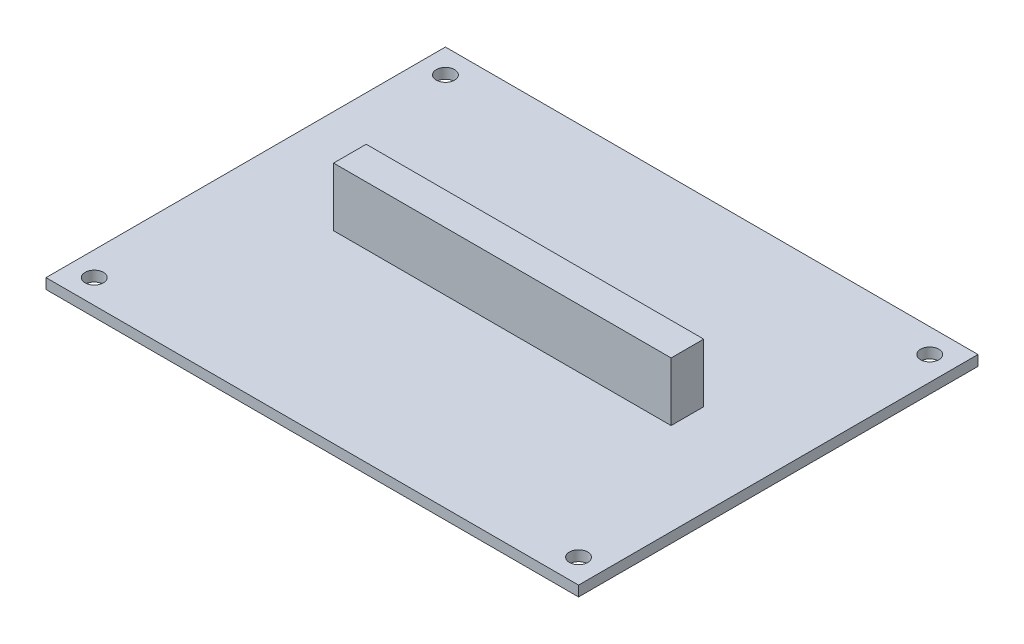
ISO-10303-21;
HEADER;
FILE_DESCRIPTION(('STEP AP214'),'2;1');
FILE_NAME('part.step','',(''),(''),'','','');
FILE_SCHEMA(('AUTOMOTIVE_DESIGN { 1 0 10303 214 1 1 1 1 }'));
ENDSEC;
DATA;
#1=APPLICATION_CONTEXT('core data for automotive mechanical design processes');
#2=APPLICATION_PROTOCOL_DEFINITION('international standard','automotive_design',2000,#1);
#3=PRODUCT_CONTEXT('',#1,'mechanical');
#4=PRODUCT('Part','Part','',(#3));
#5=PRODUCT_RELATED_PRODUCT_CATEGORY('part','',(#4));
#6=PRODUCT_DEFINITION_FORMATION('','',#4);
#7=PRODUCT_DEFINITION_CONTEXT('part definition',#1,'design');
#8=PRODUCT_DEFINITION('design','',#6,#7);
#9=PRODUCT_DEFINITION_SHAPE('','',#8);
#10=(LENGTH_UNIT() NAMED_UNIT(*) SI_UNIT(.MILLI.,.METRE.));
#11=(NAMED_UNIT(*) PLANE_ANGLE_UNIT() SI_UNIT($,.RADIAN.));
#12=(NAMED_UNIT(*) SI_UNIT($,.STERADIAN.) SOLID_ANGLE_UNIT());
#13=UNCERTAINTY_MEASURE_WITH_UNIT(LENGTH_MEASURE(1.E-05),#10,'distance_accuracy_value','');
#14=(GEOMETRIC_REPRESENTATION_CONTEXT(3) GLOBAL_UNCERTAINTY_ASSIGNED_CONTEXT((#13)) GLOBAL_UNIT_ASSIGNED_CONTEXT((#10,
#11,#12)) REPRESENTATION_CONTEXT('',''));
#15=CARTESIAN_POINT('',(0.,0.,0.));
#16=DIRECTION('',(0.,0.,1.));
#17=DIRECTION('',(1.,0.,0.));
#18=AXIS2_PLACEMENT_3D('',#15,#16,#17);
#19=CARTESIAN_POINT('',(0.,1.55,0.));
#20=DIRECTION('',(0.,-1.,0.));
#21=DIRECTION('',(0.,0.,-1.));
#22=AXIS2_PLACEMENT_3D('',#19,#20,#21);
#23=PLANE('',#22);
#24=CARTESIAN_POINT('',(36.375,1.55,26.375));
#25=DIRECTION('',(0.,1.,0.));
#26=DIRECTION('',(0.,0.,1.));
#27=AXIS2_PLACEMENT_3D('',#24,#25,#26);
#28=CIRCLE('',#27,1.375);
#29=CARTESIAN_POINT('',(36.375,1.55,25.));
#30=VERTEX_POINT('',#29);
#31=EDGE_CURVE('E132',#30,#30,#28,.T.);
#32=ORIENTED_EDGE('',*,*,#31,.F.);
#33=EDGE_LOOP('',(#32));
#34=FACE_BOUND('',#33,.T.);
#35=CARTESIAN_POINT('',(-36.375,1.55,26.375));
#36=DIRECTION('',(0.,1.,0.));
#37=DIRECTION('',(0.,0.,1.));
#38=AXIS2_PLACEMENT_3D('',#35,#36,#37);
#39=CIRCLE('',#38,1.375);
#40=CARTESIAN_POINT('',(-36.375,1.55,25.));
#41=VERTEX_POINT('',#40);
#42=EDGE_CURVE('E141',#41,#41,#39,.T.);
#43=ORIENTED_EDGE('',*,*,#42,.F.);
#44=EDGE_LOOP('',(#43));
#45=FACE_BOUND('',#44,.T.);
#46=CARTESIAN_POINT('',(-36.375,1.55,-26.375));
#47=DIRECTION('',(0.,1.,0.));
#48=DIRECTION('',(0.,0.,1.));
#49=AXIS2_PLACEMENT_3D('',#46,#47,#48);
#50=CIRCLE('',#49,1.375);
#51=CARTESIAN_POINT('',(-36.375,1.55,-27.75));
#52=VERTEX_POINT('',#51);
#53=EDGE_CURVE('E147',#52,#52,#50,.T.);
#54=ORIENTED_EDGE('',*,*,#53,.F.);
#55=EDGE_LOOP('',(#54));
#56=FACE_BOUND('',#55,.T.);
#57=CARTESIAN_POINT('',(36.375,1.55,-26.375));
#58=DIRECTION('',(0.,1.,0.));
#59=DIRECTION('',(0.,0.,1.));
#60=AXIS2_PLACEMENT_3D('',#57,#58,#59);
#61=CIRCLE('',#60,1.375);
#62=CARTESIAN_POINT('',(36.375,1.55,-27.75));
#63=VERTEX_POINT('',#62);
#64=EDGE_CURVE('E153',#63,#63,#61,.T.);
#65=ORIENTED_EDGE('',*,*,#64,.F.);
#66=EDGE_LOOP('',(#65));
#67=FACE_BOUND('',#66,.T.);
#68=DIRECTION('',(0.,0.,-1.));
#69=VECTOR('',#68,1.);
#70=CARTESIAN_POINT('',(40.,1.55,30.));
#71=LINE('',#70,#69);
#72=CARTESIAN_POINT('',(40.,1.55,30.));
#73=VERTEX_POINT('',#72);
#74=CARTESIAN_POINT('',(40.,1.55,-30.));
#75=VERTEX_POINT('',#74);
#76=EDGE_CURVE('E159',#73,#75,#71,.T.);
#77=ORIENTED_EDGE('',*,*,#76,.T.);
#78=DIRECTION('',(-1.,0.,0.));
#79=VECTOR('',#78,1.);
#80=CARTESIAN_POINT('',(-40.,1.55,-30.));
#81=LINE('',#80,#79);
#82=CARTESIAN_POINT('',(-40.,1.55,-30.));
#83=VERTEX_POINT('',#82);
#84=EDGE_CURVE('E162',#75,#83,#81,.T.);
#85=ORIENTED_EDGE('',*,*,#84,.T.);
#86=DIRECTION('',(0.,0.,1.));
#87=VECTOR('',#86,1.);
#88=CARTESIAN_POINT('',(-40.,1.55,30.));
#89=LINE('',#88,#87);
#90=CARTESIAN_POINT('',(-40.,1.55,30.));
#91=VERTEX_POINT('',#90);
#92=EDGE_CURVE('E165',#83,#91,#89,.T.);
#93=ORIENTED_EDGE('',*,*,#92,.T.);
#94=DIRECTION('',(1.,0.,0.));
#95=VECTOR('',#94,1.);
#96=CARTESIAN_POINT('',(-40.,1.55,30.));
#97=LINE('',#96,#95);
#98=EDGE_CURVE('E167',#91,#73,#97,.T.);
#99=ORIENTED_EDGE('',*,*,#98,.T.);
#100=EDGE_LOOP('',(#77,#85,#93,#99));
#101=FACE_BOUND('',#100,.T.);
#102=DIRECTION('',(0.,0.,1.));
#103=VECTOR('',#102,1.);
#104=CARTESIAN_POINT('',(-24.5,1.55,2.3));
#105=LINE('',#104,#103);
#106=CARTESIAN_POINT('',(-24.5,1.55,-2.6));
#107=VERTEX_POINT('',#106);
#108=CARTESIAN_POINT('',(-24.5,1.55,2.3));
#109=VERTEX_POINT('',#108);
#110=EDGE_CURVE('E128',#107,#109,#105,.T.);
#111=ORIENTED_EDGE('',*,*,#110,.F.);
#112=DIRECTION('',(-1.,0.,0.));
#113=VECTOR('',#112,1.);
#114=CARTESIAN_POINT('',(-24.5,1.55,-2.6));
#115=LINE('',#114,#113);
#116=CARTESIAN_POINT('',(26.2,1.55,-2.6));
#117=VERTEX_POINT('',#116);
#118=EDGE_CURVE('E125',#117,#107,#115,.T.);
#119=ORIENTED_EDGE('',*,*,#118,.F.);
#120=DIRECTION('',(0.,0.,-1.));
#121=VECTOR('',#120,1.);
#122=CARTESIAN_POINT('',(26.2,1.55,-2.6));
#123=LINE('',#122,#121);
#124=CARTESIAN_POINT('',(26.2,1.55,2.3));
#125=VERTEX_POINT('',#124);
#126=EDGE_CURVE('E63',#125,#117,#123,.T.);
#127=ORIENTED_EDGE('',*,*,#126,.F.);
#128=DIRECTION('',(1.,0.,0.));
#129=VECTOR('',#128,1.);
#130=CARTESIAN_POINT('',(26.2,1.55,2.3));
#131=LINE('',#130,#129);
#132=EDGE_CURVE('E58',#109,#125,#131,.T.);
#133=ORIENTED_EDGE('',*,*,#132,.F.);
#134=EDGE_LOOP('',(#111,#119,#127,#133));
#135=FACE_BOUND('',#134,.T.);
#136=ADVANCED_FACE('F43',(#34,#45,#56,#67,#101,#135),#23,.F.);
#137=CARTESIAN_POINT('',(0.,0.,0.));
#138=DIRECTION('',(0.,-1.,0.));
#139=DIRECTION('',(0.,0.,-1.));
#140=AXIS2_PLACEMENT_3D('',#137,#138,#139);
#141=PLANE('',#140);
#142=CARTESIAN_POINT('',(-36.375,0.,26.375));
#143=DIRECTION('',(0.,1.,0.));
#144=DIRECTION('',(0.,0.,1.));
#145=AXIS2_PLACEMENT_3D('',#142,#143,#144);
#146=CIRCLE('',#145,1.375);
#147=CARTESIAN_POINT('',(-36.375,0.,25.));
#148=VERTEX_POINT('',#147);
#149=EDGE_CURVE('E139',#148,#148,#146,.T.);
#150=ORIENTED_EDGE('',*,*,#149,.T.);
#151=EDGE_LOOP('',(#150));
#152=FACE_BOUND('',#151,.T.);
#153=CARTESIAN_POINT('',(36.375,0.,-26.375));
#154=DIRECTION('',(0.,1.,0.));
#155=DIRECTION('',(0.,0.,1.));
#156=AXIS2_PLACEMENT_3D('',#153,#154,#155);
#157=CIRCLE('',#156,1.375);
#158=CARTESIAN_POINT('',(36.375,0.,-27.75));
#159=VERTEX_POINT('',#158);
#160=EDGE_CURVE('E150',#159,#159,#157,.T.);
#161=ORIENTED_EDGE('',*,*,#160,.T.);
#162=EDGE_LOOP('',(#161));
#163=FACE_BOUND('',#162,.T.);
#164=DIRECTION('',(0.,0.,-1.));
#165=VECTOR('',#164,1.);
#166=CARTESIAN_POINT('',(40.,0.,30.));
#167=LINE('',#166,#165);
#168=CARTESIAN_POINT('',(40.,0.,30.));
#169=VERTEX_POINT('',#168);
#170=CARTESIAN_POINT('',(40.,0.,-30.));
#171=VERTEX_POINT('',#170);
#172=EDGE_CURVE('E156',#169,#171,#167,.T.);
#173=ORIENTED_EDGE('',*,*,#172,.F.);
#174=DIRECTION('',(1.,0.,0.));
#175=VECTOR('',#174,1.);
#176=CARTESIAN_POINT('',(-40.,0.,30.));
#177=LINE('',#176,#175);
#178=CARTESIAN_POINT('',(-40.,0.,30.));
#179=VERTEX_POINT('',#178);
#180=EDGE_CURVE('E163',#179,#169,#177,.T.);
#181=ORIENTED_EDGE('',*,*,#180,.F.);
#182=DIRECTION('',(0.,0.,1.));
#183=VECTOR('',#182,1.);
#184=CARTESIAN_POINT('',(-40.,0.,30.));
#185=LINE('',#184,#183);
#186=CARTESIAN_POINT('',(-40.,0.,-30.));
#187=VERTEX_POINT('',#186);
#188=EDGE_CURVE('E174',#187,#179,#185,.T.);
#189=ORIENTED_EDGE('',*,*,#188,.F.);
#190=DIRECTION('',(-1.,0.,0.));
#191=VECTOR('',#190,1.);
#192=CARTESIAN_POINT('',(-40.,0.,-30.));
#193=LINE('',#192,#191);
#194=EDGE_CURVE('E172',#171,#187,#193,.T.);
#195=ORIENTED_EDGE('',*,*,#194,.F.);
#196=EDGE_LOOP('',(#173,#181,#189,#195));
#197=FACE_BOUND('',#196,.T.);
#198=CARTESIAN_POINT('',(-36.375,0.,-26.375));
#199=DIRECTION('',(0.,1.,0.));
#200=DIRECTION('',(0.,0.,1.));
#201=AXIS2_PLACEMENT_3D('',#198,#199,#200);
#202=CIRCLE('',#201,1.375);
#203=CARTESIAN_POINT('',(-36.375,0.,-27.75));
#204=VERTEX_POINT('',#203);
#205=EDGE_CURVE('E144',#204,#204,#202,.T.);
#206=ORIENTED_EDGE('',*,*,#205,.T.);
#207=EDGE_LOOP('',(#206));
#208=FACE_BOUND('',#207,.T.);
#209=CARTESIAN_POINT('',(36.375,0.,26.375));
#210=DIRECTION('',(0.,1.,0.));
#211=DIRECTION('',(0.,0.,1.));
#212=AXIS2_PLACEMENT_3D('',#209,#210,#211);
#213=CIRCLE('',#212,1.375);
#214=CARTESIAN_POINT('',(36.375,0.,25.));
#215=VERTEX_POINT('',#214);
#216=EDGE_CURVE('E129',#215,#215,#213,.T.);
#217=ORIENTED_EDGE('',*,*,#216,.T.);
#218=EDGE_LOOP('',(#217));
#219=FACE_BOUND('',#218,.T.);
#220=ADVANCED_FACE('F192',(#152,#163,#197,#208,#219),#141,.T.);
#221=CARTESIAN_POINT('',(40.,1.55,30.));
#222=DIRECTION('',(-1.,0.,0.));
#223=DIRECTION('',(0.,0.,1.));
#224=AXIS2_PLACEMENT_3D('',#221,#222,#223);
#225=PLANE('',#224);
#226=ORIENTED_EDGE('',*,*,#172,.T.);
#227=DIRECTION('',(0.,-1.,0.));
#228=VECTOR('',#227,1.);
#229=CARTESIAN_POINT('',(40.,1.55,-30.));
#230=LINE('',#229,#228);
#231=EDGE_CURVE('E11',#75,#171,#230,.T.);
#232=ORIENTED_EDGE('',*,*,#231,.F.);
#233=ORIENTED_EDGE('',*,*,#76,.F.);
#234=DIRECTION('',(0.,-1.,0.));
#235=VECTOR('',#234,1.);
#236=CARTESIAN_POINT('',(40.,1.55,30.));
#237=LINE('',#236,#235);
#238=EDGE_CURVE('E169',#73,#169,#237,.T.);
#239=ORIENTED_EDGE('',*,*,#238,.T.);
#240=EDGE_LOOP('',(#226,#232,#233,#239));
#241=FACE_BOUND('',#240,.T.);
#242=ADVANCED_FACE('F45',(#241),#225,.F.);
#243=CARTESIAN_POINT('',(-40.,1.55,-30.));
#244=DIRECTION('',(0.,0.,1.));
#245=DIRECTION('',(1.,0.,0.));
#246=AXIS2_PLACEMENT_3D('',#243,#244,#245);
#247=PLANE('',#246);
#248=ORIENTED_EDGE('',*,*,#194,.T.);
#249=DIRECTION('',(0.,-1.,0.));
#250=VECTOR('',#249,1.);
#251=CARTESIAN_POINT('',(-40.,1.55,-30.));
#252=LINE('',#251,#250);
#253=EDGE_CURVE('E51',#83,#187,#252,.T.);
#254=ORIENTED_EDGE('',*,*,#253,.F.);
#255=ORIENTED_EDGE('',*,*,#84,.F.);
#256=ORIENTED_EDGE('',*,*,#231,.T.);
#257=EDGE_LOOP('',(#248,#254,#255,#256));
#258=FACE_BOUND('',#257,.T.);
#259=ADVANCED_FACE('F202',(#258),#247,.F.);
#260=CARTESIAN_POINT('',(-40.,1.55,30.));
#261=DIRECTION('',(1.,0.,0.));
#262=DIRECTION('',(0.,0.,-1.));
#263=AXIS2_PLACEMENT_3D('',#260,#261,#262);
#264=PLANE('',#263);
#265=ORIENTED_EDGE('',*,*,#188,.T.);
#266=DIRECTION('',(0.,-1.,0.));
#267=VECTOR('',#266,1.);
#268=CARTESIAN_POINT('',(-40.,1.55,30.));
#269=LINE('',#268,#267);
#270=EDGE_CURVE('E179',#91,#179,#269,.T.);
#271=ORIENTED_EDGE('',*,*,#270,.F.);
#272=ORIENTED_EDGE('',*,*,#92,.F.);
#273=ORIENTED_EDGE('',*,*,#253,.T.);
#274=EDGE_LOOP('',(#265,#271,#272,#273));
#275=FACE_BOUND('',#274,.T.);
#276=ADVANCED_FACE('F186',(#275),#264,.F.);
#277=CARTESIAN_POINT('',(-40.,1.55,30.));
#278=DIRECTION('',(0.,0.,-1.));
#279=DIRECTION('',(-1.,0.,0.));
#280=AXIS2_PLACEMENT_3D('',#277,#278,#279);
#281=PLANE('',#280);
#282=ORIENTED_EDGE('',*,*,#180,.T.);
#283=ORIENTED_EDGE('',*,*,#238,.F.);
#284=ORIENTED_EDGE('',*,*,#98,.F.);
#285=ORIENTED_EDGE('',*,*,#270,.T.);
#286=EDGE_LOOP('',(#282,#283,#284,#285));
#287=FACE_BOUND('',#286,.T.);
#288=ADVANCED_FACE('F196',(#287),#281,.F.);
#289=CARTESIAN_POINT('',(36.375,1.55,-26.375));
#290=DIRECTION('',(0.,-1.,0.));
#291=DIRECTION('',(0.,0.,-1.));
#292=AXIS2_PLACEMENT_3D('',#289,#290,#291);
#293=CYLINDRICAL_SURFACE('',#292,1.375);
#294=CARTESIAN_POINT('',(36.375,1.55,-27.75));
#295=CARTESIAN_POINT('',(36.375,1.53385416666667,-27.75));
#296=CARTESIAN_POINT('',(36.375,1.51770833333333,-27.75));
#297=CARTESIAN_POINT('',(36.375,1.48541666666667,-27.75));
#298=CARTESIAN_POINT('',(36.375,1.46927083333333,-27.75));
#299=CARTESIAN_POINT('',(36.375,1.43697916666667,-27.75));
#300=CARTESIAN_POINT('',(36.375,1.42083333333333,-27.75));
#301=CARTESIAN_POINT('',(36.375,1.38854166666667,-27.75));
#302=CARTESIAN_POINT('',(36.375,1.37239583333333,-27.75));
#303=CARTESIAN_POINT('',(36.375,1.34010416666667,-27.75));
#304=CARTESIAN_POINT('',(36.375,1.32395833333333,-27.75));
#305=CARTESIAN_POINT('',(36.375,1.29166666666667,-27.75));
#306=CARTESIAN_POINT('',(36.375,1.27552083333333,-27.75));
#307=CARTESIAN_POINT('',(36.375,1.24322916666667,-27.75));
#308=CARTESIAN_POINT('',(36.375,1.22708333333333,-27.75));
#309=CARTESIAN_POINT('',(36.375,1.19479166666667,-27.75));
#310=CARTESIAN_POINT('',(36.375,1.17864583333333,-27.75));
#311=CARTESIAN_POINT('',(36.375,1.14635416666667,-27.75));
#312=CARTESIAN_POINT('',(36.375,1.13020833333333,-27.75));
#313=CARTESIAN_POINT('',(36.375,1.09791666666667,-27.75));
#314=CARTESIAN_POINT('',(36.375,1.08177083333333,-27.75));
#315=CARTESIAN_POINT('',(36.375,1.04947916666667,-27.75));
#316=CARTESIAN_POINT('',(36.375,1.03333333333333,-27.75));
#317=CARTESIAN_POINT('',(36.375,1.00104166666667,-27.75));
#318=CARTESIAN_POINT('',(36.375,0.984895833333333,-27.75));
#319=CARTESIAN_POINT('',(36.375,0.952604166666667,-27.75));
#320=CARTESIAN_POINT('',(36.375,0.936458333333333,-27.75));
#321=CARTESIAN_POINT('',(36.375,0.904166666666667,-27.75));
#322=CARTESIAN_POINT('',(36.375,0.888020833333333,-27.75));
#323=CARTESIAN_POINT('',(36.375,0.855729166666667,-27.75));
#324=CARTESIAN_POINT('',(36.375,0.839583333333333,-27.75));
#325=CARTESIAN_POINT('',(36.375,0.807291666666667,-27.75));
#326=CARTESIAN_POINT('',(36.375,0.791145833333333,-27.75));
#327=CARTESIAN_POINT('',(36.375,0.758854166666667,-27.75));
#328=CARTESIAN_POINT('',(36.375,0.742708333333333,-27.75));
#329=CARTESIAN_POINT('',(36.375,0.710416666666667,-27.75));
#330=CARTESIAN_POINT('',(36.375,0.694270833333333,-27.75));
#331=CARTESIAN_POINT('',(36.375,0.661979166666667,-27.75));
#332=CARTESIAN_POINT('',(36.375,0.645833333333333,-27.75));
#333=CARTESIAN_POINT('',(36.375,0.613541666666667,-27.75));
#334=CARTESIAN_POINT('',(36.375,0.597395833333333,-27.75));
#335=CARTESIAN_POINT('',(36.375,0.565104166666667,-27.75));
#336=CARTESIAN_POINT('',(36.375,0.548958333333333,-27.75));
#337=CARTESIAN_POINT('',(36.375,0.516666666666667,-27.75));
#338=CARTESIAN_POINT('',(36.375,0.500520833333333,-27.75));
#339=CARTESIAN_POINT('',(36.375,0.468229166666667,-27.75));
#340=CARTESIAN_POINT('',(36.375,0.452083333333333,-27.75));
#341=CARTESIAN_POINT('',(36.375,0.419791666666667,-27.75));
#342=CARTESIAN_POINT('',(36.375,0.403645833333333,-27.75));
#343=CARTESIAN_POINT('',(36.375,0.371354166666667,-27.75));
#344=CARTESIAN_POINT('',(36.375,0.355208333333333,-27.75));
#345=CARTESIAN_POINT('',(36.375,0.322916666666667,-27.75));
#346=CARTESIAN_POINT('',(36.375,0.306770833333333,-27.75));
#347=CARTESIAN_POINT('',(36.375,0.274479166666667,-27.75));
#348=CARTESIAN_POINT('',(36.375,0.258333333333333,-27.75));
#349=CARTESIAN_POINT('',(36.375,0.226041666666667,-27.75));
#350=CARTESIAN_POINT('',(36.375,0.209895833333333,-27.75));
#351=CARTESIAN_POINT('',(36.375,0.177604166666667,-27.75));
#352=CARTESIAN_POINT('',(36.375,0.161458333333333,-27.75));
#353=CARTESIAN_POINT('',(36.375,0.129166666666667,-27.75));
#354=CARTESIAN_POINT('',(36.375,0.113020833333333,-27.75));
#355=CARTESIAN_POINT('',(36.375,0.0807291666666667,-27.75));
#356=CARTESIAN_POINT('',(36.375,0.0645833333333334,-27.75));
#357=CARTESIAN_POINT('',(36.375,0.0322916666666667,-27.75));
#358=CARTESIAN_POINT('',(36.375,0.0161458333333334,-27.75));
#359=CARTESIAN_POINT('',(36.375,0.,-27.75));
#360=B_SPLINE_CURVE_WITH_KNOTS('',3,(#294,#295,#296,#297,#298,#299,#300,#301,#302,#303,#304,
#305,#306,#307,#308,#309,#310,#311,#312,#313,#314,#315,#316,#317,#318,#319,#320,#321,#322,#323,
#324,#325,#326,#327,#328,#329,#330,#331,#332,#333,#334,#335,#336,#337,#338,#339,#340,#341,#342,
#343,#344,#345,#346,#347,#348,#349,#350,#351,#352,#353,#354,#355,#356,#357,#358,#359),
.UNSPECIFIED.,.F.,.F.,(4,2,2,2,2,2,2,2,2,2,2,2,2,2,2,2,2,2,2,2,2,2,2,2,2,2,2,2,2,2,2,2,4),(0.,
0.0484374999999999,0.096875,0.1453125,0.19375,0.2421875,0.290625,0.3390625,0.3875,0.4359375,
0.484375,0.5328125,0.58125,0.6296875,0.678125,0.7265625,0.775,0.8234375,0.871875,0.9203125,
0.96875,1.0171875,1.065625,1.1140625,1.1625,1.2109375,1.259375,1.3078125,1.35625,1.4046875,
1.453125,1.5015625,1.55),.UNSPECIFIED.);
#361=EDGE_CURVE('BSEAM222',#63,#159,#360,.T.);
#362=ORIENTED_EDGE('',*,*,#64,.T.);
#363=ORIENTED_EDGE('',*,*,#160,.F.);
#364=ORIENTED_EDGE('',*,*,#361,.T.);
#365=ORIENTED_EDGE('',*,*,#361,.F.);
#366=EDGE_LOOP('',(#362,#364,#363,#365));
#367=FACE_BOUND('',#366,.T.);
#368=ADVANCED_FACE('F222',(#367),#293,.F.);
#369=CARTESIAN_POINT('',(-36.375,1.55,-26.375));
#370=DIRECTION('',(0.,-1.,0.));
#371=DIRECTION('',(0.,0.,-1.));
#372=AXIS2_PLACEMENT_3D('',#369,#370,#371);
#373=CYLINDRICAL_SURFACE('',#372,1.375);
#374=CARTESIAN_POINT('',(-36.375,1.55,-27.75));
#375=CARTESIAN_POINT('',(-36.375,1.53385416666667,-27.75));
#376=CARTESIAN_POINT('',(-36.375,1.51770833333333,-27.75));
#377=CARTESIAN_POINT('',(-36.375,1.48541666666667,-27.75));
#378=CARTESIAN_POINT('',(-36.375,1.46927083333333,-27.75));
#379=CARTESIAN_POINT('',(-36.375,1.43697916666667,-27.75));
#380=CARTESIAN_POINT('',(-36.375,1.42083333333333,-27.75));
#381=CARTESIAN_POINT('',(-36.375,1.38854166666667,-27.75));
#382=CARTESIAN_POINT('',(-36.375,1.37239583333333,-27.75));
#383=CARTESIAN_POINT('',(-36.375,1.34010416666667,-27.75));
#384=CARTESIAN_POINT('',(-36.375,1.32395833333333,-27.75));
#385=CARTESIAN_POINT('',(-36.375,1.29166666666667,-27.75));
#386=CARTESIAN_POINT('',(-36.375,1.27552083333333,-27.75));
#387=CARTESIAN_POINT('',(-36.375,1.24322916666667,-27.75));
#388=CARTESIAN_POINT('',(-36.375,1.22708333333333,-27.75));
#389=CARTESIAN_POINT('',(-36.375,1.19479166666667,-27.75));
#390=CARTESIAN_POINT('',(-36.375,1.17864583333333,-27.75));
#391=CARTESIAN_POINT('',(-36.375,1.14635416666667,-27.75));
#392=CARTESIAN_POINT('',(-36.375,1.13020833333333,-27.75));
#393=CARTESIAN_POINT('',(-36.375,1.09791666666667,-27.75));
#394=CARTESIAN_POINT('',(-36.375,1.08177083333333,-27.75));
#395=CARTESIAN_POINT('',(-36.375,1.04947916666667,-27.75));
#396=CARTESIAN_POINT('',(-36.375,1.03333333333333,-27.75));
#397=CARTESIAN_POINT('',(-36.375,1.00104166666667,-27.75));
#398=CARTESIAN_POINT('',(-36.375,0.984895833333333,-27.75));
#399=CARTESIAN_POINT('',(-36.375,0.952604166666667,-27.75));
#400=CARTESIAN_POINT('',(-36.375,0.936458333333333,-27.75));
#401=CARTESIAN_POINT('',(-36.375,0.904166666666667,-27.75));
#402=CARTESIAN_POINT('',(-36.375,0.888020833333333,-27.75));
#403=CARTESIAN_POINT('',(-36.375,0.855729166666667,-27.75));
#404=CARTESIAN_POINT('',(-36.375,0.839583333333333,-27.75));
#405=CARTESIAN_POINT('',(-36.375,0.807291666666667,-27.75));
#406=CARTESIAN_POINT('',(-36.375,0.791145833333333,-27.75));
#407=CARTESIAN_POINT('',(-36.375,0.758854166666667,-27.75));
#408=CARTESIAN_POINT('',(-36.375,0.742708333333333,-27.75));
#409=CARTESIAN_POINT('',(-36.375,0.710416666666667,-27.75));
#410=CARTESIAN_POINT('',(-36.375,0.694270833333333,-27.75));
#411=CARTESIAN_POINT('',(-36.375,0.661979166666667,-27.75));
#412=CARTESIAN_POINT('',(-36.375,0.645833333333333,-27.75));
#413=CARTESIAN_POINT('',(-36.375,0.613541666666667,-27.75));
#414=CARTESIAN_POINT('',(-36.375,0.597395833333333,-27.75));
#415=CARTESIAN_POINT('',(-36.375,0.565104166666667,-27.75));
#416=CARTESIAN_POINT('',(-36.375,0.548958333333333,-27.75));
#417=CARTESIAN_POINT('',(-36.375,0.516666666666667,-27.75));
#418=CARTESIAN_POINT('',(-36.375,0.500520833333333,-27.75));
#419=CARTESIAN_POINT('',(-36.375,0.468229166666667,-27.75));
#420=CARTESIAN_POINT('',(-36.375,0.452083333333333,-27.75));
#421=CARTESIAN_POINT('',(-36.375,0.419791666666667,-27.75));
#422=CARTESIAN_POINT('',(-36.375,0.403645833333333,-27.75));
#423=CARTESIAN_POINT('',(-36.375,0.371354166666667,-27.75));
#424=CARTESIAN_POINT('',(-36.375,0.355208333333333,-27.75));
#425=CARTESIAN_POINT('',(-36.375,0.322916666666667,-27.75));
#426=CARTESIAN_POINT('',(-36.375,0.306770833333333,-27.75));
#427=CARTESIAN_POINT('',(-36.375,0.274479166666667,-27.75));
#428=CARTESIAN_POINT('',(-36.375,0.258333333333333,-27.75));
#429=CARTESIAN_POINT('',(-36.375,0.226041666666667,-27.75));
#430=CARTESIAN_POINT('',(-36.375,0.209895833333333,-27.75));
#431=CARTESIAN_POINT('',(-36.375,0.177604166666667,-27.75));
#432=CARTESIAN_POINT('',(-36.375,0.161458333333333,-27.75));
#433=CARTESIAN_POINT('',(-36.375,0.129166666666667,-27.75));
#434=CARTESIAN_POINT('',(-36.375,0.113020833333333,-27.75));
#435=CARTESIAN_POINT('',(-36.375,0.0807291666666667,-27.75));
#436=CARTESIAN_POINT('',(-36.375,0.0645833333333334,-27.75));
#437=CARTESIAN_POINT('',(-36.375,0.0322916666666667,-27.75));
#438=CARTESIAN_POINT('',(-36.375,0.0161458333333334,-27.75));
#439=CARTESIAN_POINT('',(-36.375,0.,-27.75));
#440=B_SPLINE_CURVE_WITH_KNOTS('',3,(#374,#375,#376,#377,#378,#379,#380,#381,#382,#383,#384,
#385,#386,#387,#388,#389,#390,#391,#392,#393,#394,#395,#396,#397,#398,#399,#400,#401,#402,#403,
#404,#405,#406,#407,#408,#409,#410,#411,#412,#413,#414,#415,#416,#417,#418,#419,#420,#421,#422,
#423,#424,#425,#426,#427,#428,#429,#430,#431,#432,#433,#434,#435,#436,#437,#438,#439),
.UNSPECIFIED.,.F.,.F.,(4,2,2,2,2,2,2,2,2,2,2,2,2,2,2,2,2,2,2,2,2,2,2,2,2,2,2,2,2,2,2,2,4),(0.,
0.0484374999999999,0.096875,0.1453125,0.19375,0.2421875,0.290625,0.3390625,0.3875,0.4359375,
0.484375,0.5328125,0.58125,0.6296875,0.678125,0.7265625,0.775,0.8234375,0.871875,0.9203125,
0.96875,1.0171875,1.065625,1.1140625,1.1625,1.2109375,1.259375,1.3078125,1.35625,1.4046875,
1.453125,1.5015625,1.55),.UNSPECIFIED.);
#441=EDGE_CURVE('BSEAM229',#52,#204,#440,.T.);
#442=ORIENTED_EDGE('',*,*,#53,.T.);
#443=ORIENTED_EDGE('',*,*,#205,.F.);
#444=ORIENTED_EDGE('',*,*,#441,.T.);
#445=ORIENTED_EDGE('',*,*,#441,.F.);
#446=EDGE_LOOP('',(#442,#444,#443,#445));
#447=FACE_BOUND('',#446,.T.);
#448=ADVANCED_FACE('F229',(#447),#373,.F.);
#449=CARTESIAN_POINT('',(-36.375,1.55,26.375));
#450=DIRECTION('',(0.,-1.,0.));
#451=DIRECTION('',(0.,0.,-1.));
#452=AXIS2_PLACEMENT_3D('',#449,#450,#451);
#453=CYLINDRICAL_SURFACE('',#452,1.375);
#454=CARTESIAN_POINT('',(-36.375,1.55,25.));
#455=CARTESIAN_POINT('',(-36.375,1.53385416666667,25.));
#456=CARTESIAN_POINT('',(-36.375,1.51770833333333,25.));
#457=CARTESIAN_POINT('',(-36.375,1.48541666666667,25.));
#458=CARTESIAN_POINT('',(-36.375,1.46927083333333,25.));
#459=CARTESIAN_POINT('',(-36.375,1.43697916666667,25.));
#460=CARTESIAN_POINT('',(-36.375,1.42083333333333,25.));
#461=CARTESIAN_POINT('',(-36.375,1.38854166666667,25.));
#462=CARTESIAN_POINT('',(-36.375,1.37239583333333,25.));
#463=CARTESIAN_POINT('',(-36.375,1.34010416666667,25.));
#464=CARTESIAN_POINT('',(-36.375,1.32395833333333,25.));
#465=CARTESIAN_POINT('',(-36.375,1.29166666666667,25.));
#466=CARTESIAN_POINT('',(-36.375,1.27552083333333,25.));
#467=CARTESIAN_POINT('',(-36.375,1.24322916666667,25.));
#468=CARTESIAN_POINT('',(-36.375,1.22708333333333,25.));
#469=CARTESIAN_POINT('',(-36.375,1.19479166666667,25.));
#470=CARTESIAN_POINT('',(-36.375,1.17864583333333,25.));
#471=CARTESIAN_POINT('',(-36.375,1.14635416666667,25.));
#472=CARTESIAN_POINT('',(-36.375,1.13020833333333,25.));
#473=CARTESIAN_POINT('',(-36.375,1.09791666666667,25.));
#474=CARTESIAN_POINT('',(-36.375,1.08177083333333,25.));
#475=CARTESIAN_POINT('',(-36.375,1.04947916666667,25.));
#476=CARTESIAN_POINT('',(-36.375,1.03333333333333,25.));
#477=CARTESIAN_POINT('',(-36.375,1.00104166666667,25.));
#478=CARTESIAN_POINT('',(-36.375,0.984895833333333,25.));
#479=CARTESIAN_POINT('',(-36.375,0.952604166666667,25.));
#480=CARTESIAN_POINT('',(-36.375,0.936458333333333,25.));
#481=CARTESIAN_POINT('',(-36.375,0.904166666666667,25.));
#482=CARTESIAN_POINT('',(-36.375,0.888020833333333,25.));
#483=CARTESIAN_POINT('',(-36.375,0.855729166666667,25.));
#484=CARTESIAN_POINT('',(-36.375,0.839583333333333,25.));
#485=CARTESIAN_POINT('',(-36.375,0.807291666666667,25.));
#486=CARTESIAN_POINT('',(-36.375,0.791145833333333,25.));
#487=CARTESIAN_POINT('',(-36.375,0.758854166666667,25.));
#488=CARTESIAN_POINT('',(-36.375,0.742708333333333,25.));
#489=CARTESIAN_POINT('',(-36.375,0.710416666666667,25.));
#490=CARTESIAN_POINT('',(-36.375,0.694270833333333,25.));
#491=CARTESIAN_POINT('',(-36.375,0.661979166666667,25.));
#492=CARTESIAN_POINT('',(-36.375,0.645833333333333,25.));
#493=CARTESIAN_POINT('',(-36.375,0.613541666666667,25.));
#494=CARTESIAN_POINT('',(-36.375,0.597395833333333,25.));
#495=CARTESIAN_POINT('',(-36.375,0.565104166666667,25.));
#496=CARTESIAN_POINT('',(-36.375,0.548958333333333,25.));
#497=CARTESIAN_POINT('',(-36.375,0.516666666666667,25.));
#498=CARTESIAN_POINT('',(-36.375,0.500520833333333,25.));
#499=CARTESIAN_POINT('',(-36.375,0.468229166666667,25.));
#500=CARTESIAN_POINT('',(-36.375,0.452083333333333,25.));
#501=CARTESIAN_POINT('',(-36.375,0.419791666666667,25.));
#502=CARTESIAN_POINT('',(-36.375,0.403645833333333,25.));
#503=CARTESIAN_POINT('',(-36.375,0.371354166666667,25.));
#504=CARTESIAN_POINT('',(-36.375,0.355208333333333,25.));
#505=CARTESIAN_POINT('',(-36.375,0.322916666666667,25.));
#506=CARTESIAN_POINT('',(-36.375,0.306770833333333,25.));
#507=CARTESIAN_POINT('',(-36.375,0.274479166666667,25.));
#508=CARTESIAN_POINT('',(-36.375,0.258333333333333,25.));
#509=CARTESIAN_POINT('',(-36.375,0.226041666666667,25.));
#510=CARTESIAN_POINT('',(-36.375,0.209895833333333,25.));
#511=CARTESIAN_POINT('',(-36.375,0.177604166666667,25.));
#512=CARTESIAN_POINT('',(-36.375,0.161458333333333,25.));
#513=CARTESIAN_POINT('',(-36.375,0.129166666666667,25.));
#514=CARTESIAN_POINT('',(-36.375,0.113020833333333,25.));
#515=CARTESIAN_POINT('',(-36.375,0.0807291666666667,25.));
#516=CARTESIAN_POINT('',(-36.375,0.0645833333333334,25.));
#517=CARTESIAN_POINT('',(-36.375,0.0322916666666667,25.));
#518=CARTESIAN_POINT('',(-36.375,0.0161458333333334,25.));
#519=CARTESIAN_POINT('',(-36.375,0.,25.));
#520=B_SPLINE_CURVE_WITH_KNOTS('',3,(#454,#455,#456,#457,#458,#459,#460,#461,#462,#463,#464,
#465,#466,#467,#468,#469,#470,#471,#472,#473,#474,#475,#476,#477,#478,#479,#480,#481,#482,#483,
#484,#485,#486,#487,#488,#489,#490,#491,#492,#493,#494,#495,#496,#497,#498,#499,#500,#501,#502,
#503,#504,#505,#506,#507,#508,#509,#510,#511,#512,#513,#514,#515,#516,#517,#518,#519),
.UNSPECIFIED.,.F.,.F.,(4,2,2,2,2,2,2,2,2,2,2,2,2,2,2,2,2,2,2,2,2,2,2,2,2,2,2,2,2,2,2,2,4),(0.,
0.0484374999999999,0.096875,0.1453125,0.19375,0.2421875,0.290625,0.3390625,0.3875,0.4359375,
0.484375,0.5328125,0.58125,0.6296875,0.678125,0.7265625,0.775,0.8234375,0.871875,0.9203125,
0.96875,1.0171875,1.065625,1.1140625,1.1625,1.2109375,1.259375,1.3078125,1.35625,1.4046875,
1.453125,1.5015625,1.55),.UNSPECIFIED.);
#521=EDGE_CURVE('BSEAM234',#41,#148,#520,.T.);
#522=ORIENTED_EDGE('',*,*,#42,.T.);
#523=ORIENTED_EDGE('',*,*,#149,.F.);
#524=ORIENTED_EDGE('',*,*,#521,.T.);
#525=ORIENTED_EDGE('',*,*,#521,.F.);
#526=EDGE_LOOP('',(#522,#524,#523,#525));
#527=FACE_BOUND('',#526,.T.);
#528=ADVANCED_FACE('F234',(#527),#453,.F.);
#529=CARTESIAN_POINT('',(36.375,1.55,26.375));
#530=DIRECTION('',(0.,-1.,0.));
#531=DIRECTION('',(0.,0.,-1.));
#532=AXIS2_PLACEMENT_3D('',#529,#530,#531);
#533=CYLINDRICAL_SURFACE('',#532,1.375);
#534=CARTESIAN_POINT('',(36.375,1.55,25.));
#535=CARTESIAN_POINT('',(36.375,1.53385416666667,25.));
#536=CARTESIAN_POINT('',(36.375,1.51770833333333,25.));
#537=CARTESIAN_POINT('',(36.375,1.48541666666667,25.));
#538=CARTESIAN_POINT('',(36.375,1.46927083333333,25.));
#539=CARTESIAN_POINT('',(36.375,1.43697916666667,25.));
#540=CARTESIAN_POINT('',(36.375,1.42083333333333,25.));
#541=CARTESIAN_POINT('',(36.375,1.38854166666667,25.));
#542=CARTESIAN_POINT('',(36.375,1.37239583333333,25.));
#543=CARTESIAN_POINT('',(36.375,1.34010416666667,25.));
#544=CARTESIAN_POINT('',(36.375,1.32395833333333,25.));
#545=CARTESIAN_POINT('',(36.375,1.29166666666667,25.));
#546=CARTESIAN_POINT('',(36.375,1.27552083333333,25.));
#547=CARTESIAN_POINT('',(36.375,1.24322916666667,25.));
#548=CARTESIAN_POINT('',(36.375,1.22708333333333,25.));
#549=CARTESIAN_POINT('',(36.375,1.19479166666667,25.));
#550=CARTESIAN_POINT('',(36.375,1.17864583333333,25.));
#551=CARTESIAN_POINT('',(36.375,1.14635416666667,25.));
#552=CARTESIAN_POINT('',(36.375,1.13020833333333,25.));
#553=CARTESIAN_POINT('',(36.375,1.09791666666667,25.));
#554=CARTESIAN_POINT('',(36.375,1.08177083333333,25.));
#555=CARTESIAN_POINT('',(36.375,1.04947916666667,25.));
#556=CARTESIAN_POINT('',(36.375,1.03333333333333,25.));
#557=CARTESIAN_POINT('',(36.375,1.00104166666667,25.));
#558=CARTESIAN_POINT('',(36.375,0.984895833333333,25.));
#559=CARTESIAN_POINT('',(36.375,0.952604166666667,25.));
#560=CARTESIAN_POINT('',(36.375,0.936458333333333,25.));
#561=CARTESIAN_POINT('',(36.375,0.904166666666667,25.));
#562=CARTESIAN_POINT('',(36.375,0.888020833333333,25.));
#563=CARTESIAN_POINT('',(36.375,0.855729166666667,25.));
#564=CARTESIAN_POINT('',(36.375,0.839583333333333,25.));
#565=CARTESIAN_POINT('',(36.375,0.807291666666667,25.));
#566=CARTESIAN_POINT('',(36.375,0.791145833333333,25.));
#567=CARTESIAN_POINT('',(36.375,0.758854166666667,25.));
#568=CARTESIAN_POINT('',(36.375,0.742708333333333,25.));
#569=CARTESIAN_POINT('',(36.375,0.710416666666667,25.));
#570=CARTESIAN_POINT('',(36.375,0.694270833333333,25.));
#571=CARTESIAN_POINT('',(36.375,0.661979166666667,25.));
#572=CARTESIAN_POINT('',(36.375,0.645833333333333,25.));
#573=CARTESIAN_POINT('',(36.375,0.613541666666667,25.));
#574=CARTESIAN_POINT('',(36.375,0.597395833333333,25.));
#575=CARTESIAN_POINT('',(36.375,0.565104166666667,25.));
#576=CARTESIAN_POINT('',(36.375,0.548958333333333,25.));
#577=CARTESIAN_POINT('',(36.375,0.516666666666667,25.));
#578=CARTESIAN_POINT('',(36.375,0.500520833333333,25.));
#579=CARTESIAN_POINT('',(36.375,0.468229166666667,25.));
#580=CARTESIAN_POINT('',(36.375,0.452083333333333,25.));
#581=CARTESIAN_POINT('',(36.375,0.419791666666667,25.));
#582=CARTESIAN_POINT('',(36.375,0.403645833333333,25.));
#583=CARTESIAN_POINT('',(36.375,0.371354166666667,25.));
#584=CARTESIAN_POINT('',(36.375,0.355208333333333,25.));
#585=CARTESIAN_POINT('',(36.375,0.322916666666667,25.));
#586=CARTESIAN_POINT('',(36.375,0.306770833333333,25.));
#587=CARTESIAN_POINT('',(36.375,0.274479166666667,25.));
#588=CARTESIAN_POINT('',(36.375,0.258333333333333,25.));
#589=CARTESIAN_POINT('',(36.375,0.226041666666667,25.));
#590=CARTESIAN_POINT('',(36.375,0.209895833333333,25.));
#591=CARTESIAN_POINT('',(36.375,0.177604166666667,25.));
#592=CARTESIAN_POINT('',(36.375,0.161458333333333,25.));
#593=CARTESIAN_POINT('',(36.375,0.129166666666667,25.));
#594=CARTESIAN_POINT('',(36.375,0.113020833333333,25.));
#595=CARTESIAN_POINT('',(36.375,0.0807291666666667,25.));
#596=CARTESIAN_POINT('',(36.375,0.0645833333333334,25.));
#597=CARTESIAN_POINT('',(36.375,0.0322916666666667,25.));
#598=CARTESIAN_POINT('',(36.375,0.0161458333333334,25.));
#599=CARTESIAN_POINT('',(36.375,0.,25.));
#600=B_SPLINE_CURVE_WITH_KNOTS('',3,(#534,#535,#536,#537,#538,#539,#540,#541,#542,#543,#544,
#545,#546,#547,#548,#549,#550,#551,#552,#553,#554,#555,#556,#557,#558,#559,#560,#561,#562,#563,
#564,#565,#566,#567,#568,#569,#570,#571,#572,#573,#574,#575,#576,#577,#578,#579,#580,#581,#582,
#583,#584,#585,#586,#587,#588,#589,#590,#591,#592,#593,#594,#595,#596,#597,#598,#599),
.UNSPECIFIED.,.F.,.F.,(4,2,2,2,2,2,2,2,2,2,2,2,2,2,2,2,2,2,2,2,2,2,2,2,2,2,2,2,2,2,2,2,4),(0.,
0.0484374999999999,0.096875,0.1453125,0.19375,0.2421875,0.290625,0.3390625,0.3875,0.4359375,
0.484375,0.5328125,0.58125,0.6296875,0.678125,0.7265625,0.775,0.8234375,0.871875,0.9203125,
0.96875,1.0171875,1.065625,1.1140625,1.1625,1.2109375,1.259375,1.3078125,1.35625,1.4046875,
1.453125,1.5015625,1.55),.UNSPECIFIED.);
#601=EDGE_CURVE('BSEAM244',#30,#215,#600,.T.);
#602=ORIENTED_EDGE('',*,*,#31,.T.);
#603=ORIENTED_EDGE('',*,*,#216,.F.);
#604=ORIENTED_EDGE('',*,*,#601,.T.);
#605=ORIENTED_EDGE('',*,*,#601,.F.);
#606=EDGE_LOOP('',(#602,#604,#603,#605));
#607=FACE_BOUND('',#606,.T.);
#608=ADVANCED_FACE('F244',(#607),#533,.F.);
#609=CARTESIAN_POINT('',(-24.5,10.35,2.3));
#610=DIRECTION('',(1.,0.,0.));
#611=DIRECTION('',(0.,0.,-1.));
#612=AXIS2_PLACEMENT_3D('',#609,#610,#611);
#613=PLANE('',#612);
#614=ORIENTED_EDGE('',*,*,#110,.T.);
#615=DIRECTION('',(0.,-1.,0.));
#616=VECTOR('',#615,1.);
#617=CARTESIAN_POINT('',(-24.5,10.35,2.3));
#618=LINE('',#617,#616);
#619=CARTESIAN_POINT('',(-24.5,10.35,2.3));
#620=VERTEX_POINT('',#619);
#621=EDGE_CURVE('E109',#620,#109,#618,.T.);
#622=ORIENTED_EDGE('',*,*,#621,.F.);
#623=DIRECTION('',(0.,0.,1.));
#624=VECTOR('',#623,1.);
#625=CARTESIAN_POINT('',(-24.5,10.35,2.3));
#626=LINE('',#625,#624);
#627=CARTESIAN_POINT('',(-24.5,10.35,-2.6));
#628=VERTEX_POINT('',#627);
#629=EDGE_CURVE('E116',#628,#620,#626,.T.);
#630=ORIENTED_EDGE('',*,*,#629,.F.);
#631=DIRECTION('',(0.,-1.,0.));
#632=VECTOR('',#631,1.);
#633=CARTESIAN_POINT('',(-24.5,10.35,-2.6));
#634=LINE('',#633,#632);
#635=EDGE_CURVE('E345',#628,#107,#634,.T.);
#636=ORIENTED_EDGE('',*,*,#635,.T.);
#637=EDGE_LOOP('',(#614,#622,#630,#636));
#638=FACE_BOUND('',#637,.T.);
#639=ADVANCED_FACE('F127',(#638),#613,.F.);
#640=CARTESIAN_POINT('',(26.2,10.35,2.3));
#641=DIRECTION('',(0.,0.,-1.));
#642=DIRECTION('',(-1.,0.,0.));
#643=AXIS2_PLACEMENT_3D('',#640,#641,#642);
#644=PLANE('',#643);
#645=ORIENTED_EDGE('',*,*,#132,.T.);
#646=DIRECTION('',(0.,-1.,0.));
#647=VECTOR('',#646,1.);
#648=CARTESIAN_POINT('',(26.2,10.35,2.3));
#649=LINE('',#648,#647);
#650=CARTESIAN_POINT('',(26.2,10.35,2.3));
#651=VERTEX_POINT('',#650);
#652=EDGE_CURVE('E112',#651,#125,#649,.T.);
#653=ORIENTED_EDGE('',*,*,#652,.F.);
#654=DIRECTION('',(1.,0.,0.));
#655=VECTOR('',#654,1.);
#656=CARTESIAN_POINT('',(26.2,10.35,2.3));
#657=LINE('',#656,#655);
#658=EDGE_CURVE('E105',#620,#651,#657,.T.);
#659=ORIENTED_EDGE('',*,*,#658,.F.);
#660=ORIENTED_EDGE('',*,*,#621,.T.);
#661=EDGE_LOOP('',(#645,#653,#659,#660));
#662=FACE_BOUND('',#661,.T.);
#663=ADVANCED_FACE('F107',(#662),#644,.F.);
#664=CARTESIAN_POINT('',(26.2,10.35,-2.6));
#665=DIRECTION('',(-1.,0.,0.));
#666=DIRECTION('',(0.,0.,1.));
#667=AXIS2_PLACEMENT_3D('',#664,#665,#666);
#668=PLANE('',#667);
#669=ORIENTED_EDGE('',*,*,#126,.T.);
#670=DIRECTION('',(0.,-1.,0.));
#671=VECTOR('',#670,1.);
#672=CARTESIAN_POINT('',(26.2,10.35,-2.6));
#673=LINE('',#672,#671);
#674=CARTESIAN_POINT('',(26.2,10.35,-2.6));
#675=VERTEX_POINT('',#674);
#676=EDGE_CURVE('E134',#675,#117,#673,.T.);
#677=ORIENTED_EDGE('',*,*,#676,.F.);
#678=DIRECTION('',(0.,0.,-1.));
#679=VECTOR('',#678,1.);
#680=CARTESIAN_POINT('',(26.2,10.35,-2.6));
#681=LINE('',#680,#679);
#682=EDGE_CURVE('E115',#651,#675,#681,.T.);
#683=ORIENTED_EDGE('',*,*,#682,.F.);
#684=ORIENTED_EDGE('',*,*,#652,.T.);
#685=EDGE_LOOP('',(#669,#677,#683,#684));
#686=FACE_BOUND('',#685,.T.);
#687=ADVANCED_FACE('F254',(#686),#668,.F.);
#688=CARTESIAN_POINT('',(-24.5,10.35,-2.6));
#689=DIRECTION('',(0.,0.,1.));
#690=DIRECTION('',(1.,0.,0.));
#691=AXIS2_PLACEMENT_3D('',#688,#689,#690);
#692=PLANE('',#691);
#693=ORIENTED_EDGE('',*,*,#118,.T.);
#694=ORIENTED_EDGE('',*,*,#635,.F.);
#695=DIRECTION('',(-1.,0.,0.));
#696=VECTOR('',#695,1.);
#697=CARTESIAN_POINT('',(-24.5,10.35,-2.6));
#698=LINE('',#697,#696);
#699=EDGE_CURVE('E121',#675,#628,#698,.T.);
#700=ORIENTED_EDGE('',*,*,#699,.F.);
#701=ORIENTED_EDGE('',*,*,#676,.T.);
#702=EDGE_LOOP('',(#693,#694,#700,#701));
#703=FACE_BOUND('',#702,.T.);
#704=ADVANCED_FACE('F257',(#703),#692,.F.);
#705=CARTESIAN_POINT('',(0.,10.35,0.));
#706=DIRECTION('',(0.,-1.,0.));
#707=DIRECTION('',(0.,0.,-1.));
#708=AXIS2_PLACEMENT_3D('',#705,#706,#707);
#709=PLANE('',#708);
#710=ORIENTED_EDGE('',*,*,#629,.T.);
#711=ORIENTED_EDGE('',*,*,#658,.T.);
#712=ORIENTED_EDGE('',*,*,#682,.T.);
#713=ORIENTED_EDGE('',*,*,#699,.T.);
#714=EDGE_LOOP('',(#710,#711,#712,#713));
#715=FACE_BOUND('',#714,.T.);
#716=ADVANCED_FACE('F119',(#715),#709,.F.);
#717=CLOSED_SHELL('',(#136,#220,#242,#259,#276,#288,#368,#448,#528,#608,#639,#663,#687,#704,#716));
#718=MANIFOLD_SOLID_BREP('B2',#717);
#719=ADVANCED_BREP_SHAPE_REPRESENTATION('',(#18,#718),#14);
#720=SHAPE_DEFINITION_REPRESENTATION(#9,#719);
ENDSEC;
END-ISO-10303-21;
